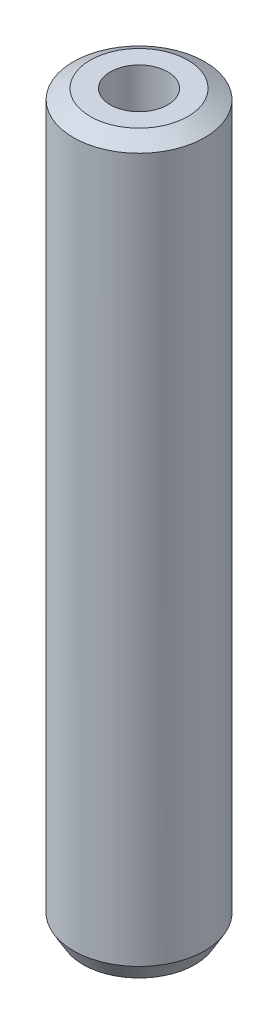
ISO-10303-21;
HEADER;
FILE_DESCRIPTION(('STEP AP214'),'2;1');
FILE_NAME('part.step','',(''),(''),'','','');
FILE_SCHEMA(('AUTOMOTIVE_DESIGN { 1 0 10303 214 1 1 1 1 }'));
ENDSEC;
DATA;
#1=APPLICATION_CONTEXT('core data for automotive mechanical design processes');
#2=APPLICATION_PROTOCOL_DEFINITION('international standard','automotive_design',2000,#1);
#3=PRODUCT_CONTEXT('',#1,'mechanical');
#4=PRODUCT('Part','Part','',(#3));
#5=PRODUCT_RELATED_PRODUCT_CATEGORY('part','',(#4));
#6=PRODUCT_DEFINITION_FORMATION('','',#4);
#7=PRODUCT_DEFINITION_CONTEXT('part definition',#1,'design');
#8=PRODUCT_DEFINITION('design','',#6,#7);
#9=PRODUCT_DEFINITION_SHAPE('','',#8);
#10=(LENGTH_UNIT() NAMED_UNIT(*) SI_UNIT(.MILLI.,.METRE.));
#11=(NAMED_UNIT(*) PLANE_ANGLE_UNIT() SI_UNIT($,.RADIAN.));
#12=(NAMED_UNIT(*) SI_UNIT($,.STERADIAN.) SOLID_ANGLE_UNIT());
#13=UNCERTAINTY_MEASURE_WITH_UNIT(LENGTH_MEASURE(1.E-05),#10,'distance_accuracy_value','');
#14=(GEOMETRIC_REPRESENTATION_CONTEXT(3) GLOBAL_UNCERTAINTY_ASSIGNED_CONTEXT((#13)) GLOBAL_UNIT_ASSIGNED_CONTEXT((#10,
#11,#12)) REPRESENTATION_CONTEXT('',''));
#15=CARTESIAN_POINT('',(0.,0.,0.));
#16=DIRECTION('',(0.,0.,1.));
#17=DIRECTION('',(1.,0.,0.));
#18=AXIS2_PLACEMENT_3D('',#15,#16,#17);
#19=CARTESIAN_POINT('',(0.,389.143097082864,0.));
#20=DIRECTION('',(0.,-1.,0.));
#21=DIRECTION('',(0.,0.,-1.));
#22=AXIS2_PLACEMENT_3D('',#19,#20,#21);
#23=CYLINDRICAL_SURFACE('',#22,35.);
#24=CARTESIAN_POINT('',(0.,383.938819477712,0.));
#25=DIRECTION('',(0.,1.,0.));
#26=DIRECTION('',(0.,0.,1.));
#27=AXIS2_PLACEMENT_3D('',#24,#25,#26);
#28=CIRCLE('',#27,35.);
#29=CARTESIAN_POINT('',(0.,383.938819477712,-35.));
#30=VERTEX_POINT('',#29);
#31=EDGE_CURVE('E50',#30,#30,#28,.F.);
#32=CARTESIAN_POINT('',(0.,9.01407322881792,0.));
#33=DIRECTION('',(0.,1.,0.));
#34=DIRECTION('',(0.,0.,1.));
#35=AXIS2_PLACEMENT_3D('',#32,#33,#34);
#36=CIRCLE('',#35,35.);
#37=CARTESIAN_POINT('',(0.,9.01407322881792,-35.));
#38=VERTEX_POINT('',#37);
#39=EDGE_CURVE('E51',#38,#38,#36,.T.);
#40=CARTESIAN_POINT('',(0.,383.938819477712,-35.));
#41=CARTESIAN_POINT('',(0.,380.033353370952,-35.));
#42=CARTESIAN_POINT('',(0.,376.127887264193,-35.));
#43=CARTESIAN_POINT('',(0.,368.316955050674,-35.));
#44=CARTESIAN_POINT('',(0.,364.411488943915,-35.));
#45=CARTESIAN_POINT('',(0.,356.600556730396,-35.));
#46=CARTESIAN_POINT('',(0.,352.695090623637,-35.));
#47=CARTESIAN_POINT('',(0.,344.884158410119,-35.));
#48=CARTESIAN_POINT('',(0.,340.978692303359,-35.));
#49=CARTESIAN_POINT('',(0.,333.167760089841,-35.));
#50=CARTESIAN_POINT('',(0.,329.262293983081,-35.));
#51=CARTESIAN_POINT('',(0.,321.451361769563,-35.));
#52=CARTESIAN_POINT('',(0.,317.545895662803,-35.));
#53=CARTESIAN_POINT('',(0.,309.734963449285,-35.));
#54=CARTESIAN_POINT('',(0.,305.829497342525,-35.));
#55=CARTESIAN_POINT('',(0.,298.018565129007,-35.));
#56=CARTESIAN_POINT('',(0.,294.113099022247,-35.));
#57=CARTESIAN_POINT('',(0.,286.302166808729,-35.));
#58=CARTESIAN_POINT('',(0.,282.39670070197,-35.));
#59=CARTESIAN_POINT('',(0.,274.585768488451,-35.));
#60=CARTESIAN_POINT('',(0.,270.680302381692,-35.));
#61=CARTESIAN_POINT('',(0.,262.869370168173,-35.));
#62=CARTESIAN_POINT('',(0.,258.963904061414,-35.));
#63=CARTESIAN_POINT('',(0.,251.152971847895,-35.));
#64=CARTESIAN_POINT('',(0.,247.247505741136,-35.));
#65=CARTESIAN_POINT('',(0.,239.436573527617,-35.));
#66=CARTESIAN_POINT('',(0.,235.531107420858,-35.));
#67=CARTESIAN_POINT('',(0.,227.720175207339,-35.));
#68=CARTESIAN_POINT('',(0.,223.81470910058,-35.));
#69=CARTESIAN_POINT('',(0.,216.003776887061,-35.));
#70=CARTESIAN_POINT('',(0.,212.098310780302,-35.));
#71=CARTESIAN_POINT('',(0.,204.287378566783,-35.));
#72=CARTESIAN_POINT('',(0.,200.381912460024,-35.));
#73=CARTESIAN_POINT('',(0.,192.570980246505,-35.));
#74=CARTESIAN_POINT('',(0.,188.665514139746,-35.));
#75=CARTESIAN_POINT('',(0.,180.854581926228,-35.));
#76=CARTESIAN_POINT('',(0.,176.949115819468,-35.));
#77=CARTESIAN_POINT('',(0.,169.13818360595,-35.));
#78=CARTESIAN_POINT('',(0.,165.23271749919,-35.));
#79=CARTESIAN_POINT('',(0.,157.421785285672,-35.));
#80=CARTESIAN_POINT('',(0.,153.516319178912,-35.));
#81=CARTESIAN_POINT('',(0.,145.705386965394,-35.));
#82=CARTESIAN_POINT('',(0.,141.799920858634,-35.));
#83=CARTESIAN_POINT('',(0.,133.988988645116,-35.));
#84=CARTESIAN_POINT('',(0.,130.083522538357,-35.));
#85=CARTESIAN_POINT('',(0.,122.272590324838,-35.));
#86=CARTESIAN_POINT('',(0.,118.367124218079,-35.));
#87=CARTESIAN_POINT('',(0.,110.55619200456,-35.));
#88=CARTESIAN_POINT('',(0.,106.650725897801,-35.));
#89=CARTESIAN_POINT('',(0.,98.8397936842821,-35.));
#90=CARTESIAN_POINT('',(0.,94.9343275775228,-35.));
#91=CARTESIAN_POINT('',(0.,87.1233953640041,-35.));
#92=CARTESIAN_POINT('',(0.,83.2179292572448,-35.));
#93=CARTESIAN_POINT('',(0.,75.4069970437262,-35.));
#94=CARTESIAN_POINT('',(0.,71.5015309369669,-35.));
#95=CARTESIAN_POINT('',(0.,63.6905987234483,-35.));
#96=CARTESIAN_POINT('',(0.,59.785132616689,-35.));
#97=CARTESIAN_POINT('',(0.,51.9742004031703,-35.));
#98=CARTESIAN_POINT('',(0.,48.068734296411,-35.));
#99=CARTESIAN_POINT('',(0.,40.2578020828924,-35.));
#100=CARTESIAN_POINT('',(0.,36.3523359761331,-35.));
#101=CARTESIAN_POINT('',(0.,28.5414037626145,-35.));
#102=CARTESIAN_POINT('',(0.,24.6359376558552,-35.));
#103=CARTESIAN_POINT('',(0.,16.8250054423365,-35.));
#104=CARTESIAN_POINT('',(0.,12.9195393355772,-35.));
#105=CARTESIAN_POINT('',(0.,9.01407322881792,-35.));
#106=B_SPLINE_CURVE_WITH_KNOTS('',3,(#40,#41,#42,#43,#44,#45,#46,#47,#48,#49,#50,#51,#52,#53,
#54,#55,#56,#57,#58,#59,#60,#61,#62,#63,#64,#65,#66,#67,#68,#69,#70,#71,#72,#73,#74,#75,#76,#77,
#78,#79,#80,#81,#82,#83,#84,#85,#86,#87,#88,#89,#90,#91,#92,#93,#94,#95,#96,#97,#98,#99,#100,
#101,#102,#103,#104,#105),.UNSPECIFIED.,.F.,.F.,(4,2,2,2,2,2,2,2,2,2,2,2,2,2,2,2,2,2,2,2,2,2,2,
2,2,2,2,2,2,2,2,2,4),(0.,11.7163983202779,23.4327966405559,35.1491949608338,46.8655932811117,
58.5819916013897,70.2983899216676,82.0147882419455,93.7311865622235,105.447584882501,
117.163983202779,128.880381523057,140.596779843335,152.313178163613,164.029576483891,
175.745974804169,187.462373124447,199.178771444725,210.895169765003,222.611568085281,
234.327966405559,246.044364725836,257.760763046114,269.477161366392,281.19355968667,
292.909958006948,304.626356327226,316.342754647504,328.059152967782,339.77555128806,
351.491949608338,363.208347928616,374.924746248894),.UNSPECIFIED.);
#107=EDGE_CURVE('BSEAM39',#30,#38,#106,.T.);
#108=ORIENTED_EDGE('',*,*,#31,.T.);
#109=ORIENTED_EDGE('',*,*,#39,.T.);
#110=ORIENTED_EDGE('',*,*,#107,.T.);
#111=ORIENTED_EDGE('',*,*,#107,.F.);
#112=EDGE_LOOP('',(#108,#110,#109,#111));
#113=FACE_BOUND('',#112,.T.);
#114=ADVANCED_FACE('F39',(#113),#23,.T.);
#115=CARTESIAN_POINT('',(0.,389.143097082864,0.));
#116=DIRECTION('',(0.,1.,0.));
#117=DIRECTION('',(0.,0.,1.));
#118=AXIS2_PLACEMENT_3D('',#115,#116,#117);
#119=PLANE('',#118);
#120=CARTESIAN_POINT('',(0.,389.143097082864,0.));
#121=DIRECTION('',(0.,1.,0.));
#122=DIRECTION('',(0.,0.,1.));
#123=AXIS2_PLACEMENT_3D('',#120,#121,#122);
#124=CIRCLE('',#123,25.985926771183);
#125=CARTESIAN_POINT('',(0.,389.143097082864,25.985926771183));
#126=VERTEX_POINT('',#125);
#127=EDGE_CURVE('E54',#126,#126,#124,.T.);
#128=ORIENTED_EDGE('',*,*,#127,.T.);
#129=EDGE_LOOP('',(#128));
#130=FACE_BOUND('',#129,.T.);
#131=CARTESIAN_POINT('',(0.,389.143097082864,0.));
#132=DIRECTION('',(0.,1.,0.));
#133=DIRECTION('',(0.,0.,1.));
#134=AXIS2_PLACEMENT_3D('',#131,#132,#133);
#135=CIRCLE('',#134,15.2707124067567);
#136=CARTESIAN_POINT('',(0.,389.143097082864,-15.2707124067567));
#137=VERTEX_POINT('',#136);
#138=EDGE_CURVE('E58',#137,#137,#135,.T.);
#139=ORIENTED_EDGE('',*,*,#138,.F.);
#140=EDGE_LOOP('',(#139));
#141=FACE_BOUND('',#140,.T.);
#142=ADVANCED_FACE('F69',(#130,#141),#119,.T.);
#143=CARTESIAN_POINT('',(0.,0.,0.));
#144=DIRECTION('',(0.,1.,0.));
#145=DIRECTION('',(0.,0.,1.));
#146=AXIS2_PLACEMENT_3D('',#143,#144,#145);
#147=PLANE('',#146);
#148=CARTESIAN_POINT('',(0.,0.,0.));
#149=DIRECTION('',(0.,1.,0.));
#150=DIRECTION('',(0.,0.,1.));
#151=AXIS2_PLACEMENT_3D('',#148,#149,#150);
#152=CIRCLE('',#151,29.795722394847);
#153=CARTESIAN_POINT('',(0.,0.,29.795722394847));
#154=VERTEX_POINT('',#153);
#155=EDGE_CURVE('E10',#154,#154,#152,.F.);
#156=ORIENTED_EDGE('',*,*,#155,.T.);
#157=EDGE_LOOP('',(#156));
#158=FACE_BOUND('',#157,.T.);
#159=CARTESIAN_POINT('',(0.,0.,0.));
#160=DIRECTION('',(0.,1.,0.));
#161=DIRECTION('',(0.,0.,1.));
#162=AXIS2_PLACEMENT_3D('',#159,#160,#161);
#163=CIRCLE('',#162,15.2707124067567);
#164=CARTESIAN_POINT('',(0.,0.,-15.2707124067567));
#165=VERTEX_POINT('',#164);
#166=EDGE_CURVE('E63',#165,#165,#163,.T.);
#167=ORIENTED_EDGE('',*,*,#166,.T.);
#168=EDGE_LOOP('',(#167));
#169=FACE_BOUND('',#168,.T.);
#170=ADVANCED_FACE('F75',(#158,#169),#147,.F.);
#171=CARTESIAN_POINT('',(0.,389.143097082864,0.));
#172=DIRECTION('',(0.,-1.,0.));
#173=DIRECTION('',(0.,0.,-1.));
#174=AXIS2_PLACEMENT_3D('',#171,#172,#173);
#175=CYLINDRICAL_SURFACE('',#174,15.2707124067567);
#176=CARTESIAN_POINT('',(0.,389.143097082864,-15.2707124067567));
#177=CARTESIAN_POINT('',(0.,385.089523154918,-15.2707124067567));
#178=CARTESIAN_POINT('',(0.,381.035949226971,-15.2707124067567));
#179=CARTESIAN_POINT('',(0.,372.928801371078,-15.2707124067567));
#180=CARTESIAN_POINT('',(0.,368.875227443132,-15.2707124067567));
#181=CARTESIAN_POINT('',(0.,360.768079587239,-15.2707124067567));
#182=CARTESIAN_POINT('',(0.,356.714505659292,-15.2707124067567));
#183=CARTESIAN_POINT('',(0.,348.607357803399,-15.2707124067567));
#184=CARTESIAN_POINT('',(0.,344.553783875453,-15.2707124067567));
#185=CARTESIAN_POINT('',(0.,336.44663601956,-15.2707124067567));
#186=CARTESIAN_POINT('',(0.,332.393062091613,-15.2707124067567));
#187=CARTESIAN_POINT('',(0.,324.28591423572,-15.2707124067567));
#188=CARTESIAN_POINT('',(0.,320.232340307774,-15.2707124067567));
#189=CARTESIAN_POINT('',(0.,312.125192451881,-15.2707124067567));
#190=CARTESIAN_POINT('',(0.,308.071618523934,-15.2707124067567));
#191=CARTESIAN_POINT('',(0.,299.964470668041,-15.2707124067567));
#192=CARTESIAN_POINT('',(0.,295.910896740095,-15.2707124067567));
#193=CARTESIAN_POINT('',(0.,287.803748884202,-15.2707124067567));
#194=CARTESIAN_POINT('',(0.,283.750174956255,-15.2707124067567));
#195=CARTESIAN_POINT('',(0.,275.643027100362,-15.2707124067567));
#196=CARTESIAN_POINT('',(0.,271.589453172416,-15.2707124067567));
#197=CARTESIAN_POINT('',(0.,263.482305316523,-15.2707124067567));
#198=CARTESIAN_POINT('',(0.,259.428731388576,-15.2707124067567));
#199=CARTESIAN_POINT('',(0.,251.321583532683,-15.2707124067567));
#200=CARTESIAN_POINT('',(0.,247.268009604737,-15.2707124067567));
#201=CARTESIAN_POINT('',(0.,239.160861748844,-15.2707124067567));
#202=CARTESIAN_POINT('',(0.,235.107287820897,-15.2707124067567));
#203=CARTESIAN_POINT('',(0.,227.000139965004,-15.2707124067567));
#204=CARTESIAN_POINT('',(0.,222.946566037058,-15.2707124067567));
#205=CARTESIAN_POINT('',(0.,214.839418181165,-15.2707124067567));
#206=CARTESIAN_POINT('',(0.,210.785844253218,-15.2707124067567));
#207=CARTESIAN_POINT('',(0.,202.678696397325,-15.2707124067567));
#208=CARTESIAN_POINT('',(0.,198.625122469379,-15.2707124067567));
#209=CARTESIAN_POINT('',(0.,190.517974613486,-15.2707124067567));
#210=CARTESIAN_POINT('',(0.,186.464400685539,-15.2707124067567));
#211=CARTESIAN_POINT('',(0.,178.357252829646,-15.2707124067567));
#212=CARTESIAN_POINT('',(0.,174.3036789017,-15.2707124067567));
#213=CARTESIAN_POINT('',(0.,166.196531045807,-15.2707124067567));
#214=CARTESIAN_POINT('',(0.,162.14295711786,-15.2707124067567));
#215=CARTESIAN_POINT('',(0.,154.035809261967,-15.2707124067567));
#216=CARTESIAN_POINT('',(0.,149.982235334021,-15.2707124067567));
#217=CARTESIAN_POINT('',(0.,141.875087478128,-15.2707124067567));
#218=CARTESIAN_POINT('',(0.,137.821513550181,-15.2707124067567));
#219=CARTESIAN_POINT('',(0.,129.714365694288,-15.2707124067567));
#220=CARTESIAN_POINT('',(0.,125.660791766342,-15.2707124067567));
#221=CARTESIAN_POINT('',(0.,117.553643910449,-15.2707124067567));
#222=CARTESIAN_POINT('',(0.,113.500069982502,-15.2707124067567));
#223=CARTESIAN_POINT('',(0.,105.392922126609,-15.2707124067567));
#224=CARTESIAN_POINT('',(0.,101.339348198663,-15.2707124067567));
#225=CARTESIAN_POINT('',(0.,93.2322003427695,-15.2707124067567));
#226=CARTESIAN_POINT('',(0.,89.178626414823,-15.2707124067567));
#227=CARTESIAN_POINT('',(0.,81.07147855893,-15.2707124067567));
#228=CARTESIAN_POINT('',(0.,77.0179046309835,-15.2707124067567));
#229=CARTESIAN_POINT('',(0.,68.9107567750905,-15.2707124067567));
#230=CARTESIAN_POINT('',(0.,64.857182847144,-15.2707124067567));
#231=CARTESIAN_POINT('',(0.,56.750034991251,-15.2707124067567));
#232=CARTESIAN_POINT('',(0.,52.6964610633045,-15.2707124067567));
#233=CARTESIAN_POINT('',(0.,44.5893132074115,-15.2707124067567));
#234=CARTESIAN_POINT('',(0.,40.535739279465,-15.2707124067567));
#235=CARTESIAN_POINT('',(0.,32.428591423572,-15.2707124067567));
#236=CARTESIAN_POINT('',(0.,28.3750174956255,-15.2707124067567));
#237=CARTESIAN_POINT('',(0.,20.2678696397325,-15.2707124067567));
#238=CARTESIAN_POINT('',(0.,16.214295711786,-15.2707124067567));
#239=CARTESIAN_POINT('',(0.,8.10714785589297,-15.2707124067567));
#240=CARTESIAN_POINT('',(0.,4.05357392794646,-15.2707124067567));
#241=CARTESIAN_POINT('',(0.,0.,-15.2707124067567));
#242=B_SPLINE_CURVE_WITH_KNOTS('',3,(#176,#177,#178,#179,#180,#181,#182,#183,#184,#185,#186,
#187,#188,#189,#190,#191,#192,#193,#194,#195,#196,#197,#198,#199,#200,#201,#202,#203,#204,#205,
#206,#207,#208,#209,#210,#211,#212,#213,#214,#215,#216,#217,#218,#219,#220,#221,#222,#223,#224,
#225,#226,#227,#228,#229,#230,#231,#232,#233,#234,#235,#236,#237,#238,#239,#240,#241),
.UNSPECIFIED.,.F.,.F.,(4,2,2,2,2,2,2,2,2,2,2,2,2,2,2,2,2,2,2,2,2,2,2,2,2,2,2,2,2,2,2,2,4),(0.,
12.1607217838395,24.321443567679,36.4821653515185,48.642887135358,60.8036089191975,
72.964330703037,85.1250524868765,97.285774270716,109.446496054556,121.607217838395,
133.767939622235,145.928661406074,158.089383189914,170.250104973753,182.410826757593,
194.571548541432,206.732270325272,218.892992109111,231.053713892951,243.21443567679,
255.37515746063,267.535879244469,279.696601028309,291.857322812148,304.018044595988,
316.178766379827,328.339488163667,340.500209947506,352.660931731346,364.821653515185,
376.982375299025,389.143097082864),.UNSPECIFIED.);
#243=EDGE_CURVE('BSEAM70',#137,#165,#242,.T.);
#244=ORIENTED_EDGE('',*,*,#138,.T.);
#245=ORIENTED_EDGE('',*,*,#166,.F.);
#246=ORIENTED_EDGE('',*,*,#243,.T.);
#247=ORIENTED_EDGE('',*,*,#243,.F.);
#248=EDGE_LOOP('',(#244,#246,#245,#247));
#249=FACE_BOUND('',#248,.T.);
#250=ADVANCED_FACE('F70',(#249),#175,.F.);
#251=CARTESIAN_POINT('',(0.,389.143097082864,0.));
#252=DIRECTION('',(0.,-1.,0.));
#253=DIRECTION('',(0.,0.,-1.));
#254=AXIS2_PLACEMENT_3D('',#251,#252,#253);
#255=CONICAL_SURFACE('',#254,25.985926771183,1.04719755119659);
#256=ORIENTED_EDGE('',*,*,#31,.F.);
#257=EDGE_LOOP('',(#256));
#258=FACE_BOUND('',#257,.T.);
#259=ORIENTED_EDGE('',*,*,#127,.F.);
#260=EDGE_LOOP('',(#259));
#261=FACE_BOUND('',#260,.T.);
#262=ADVANCED_FACE('F81',(#258,#261),#255,.T.);
#263=CARTESIAN_POINT('',(0.,9.01407322881792,0.));
#264=DIRECTION('',(0.,1.,0.));
#265=DIRECTION('',(0.,0.,1.));
#266=AXIS2_PLACEMENT_3D('',#263,#264,#265);
#267=CONICAL_SURFACE('',#266,35.,0.523598775598302);
#268=ORIENTED_EDGE('',*,*,#155,.F.);
#269=EDGE_LOOP('',(#268));
#270=FACE_BOUND('',#269,.T.);
#271=ORIENTED_EDGE('',*,*,#39,.F.);
#272=EDGE_LOOP('',(#271));
#273=FACE_BOUND('',#272,.T.);
#274=ADVANCED_FACE('F45',(#270,#273),#267,.T.);
#275=CLOSED_SHELL('',(#114,#142,#170,#250,#262,#274));
#276=MANIFOLD_SOLID_BREP('B2',#275);
#277=ADVANCED_BREP_SHAPE_REPRESENTATION('',(#18,#276),#14);
#278=SHAPE_DEFINITION_REPRESENTATION(#9,#277);
ENDSEC;
END-ISO-10303-21;
